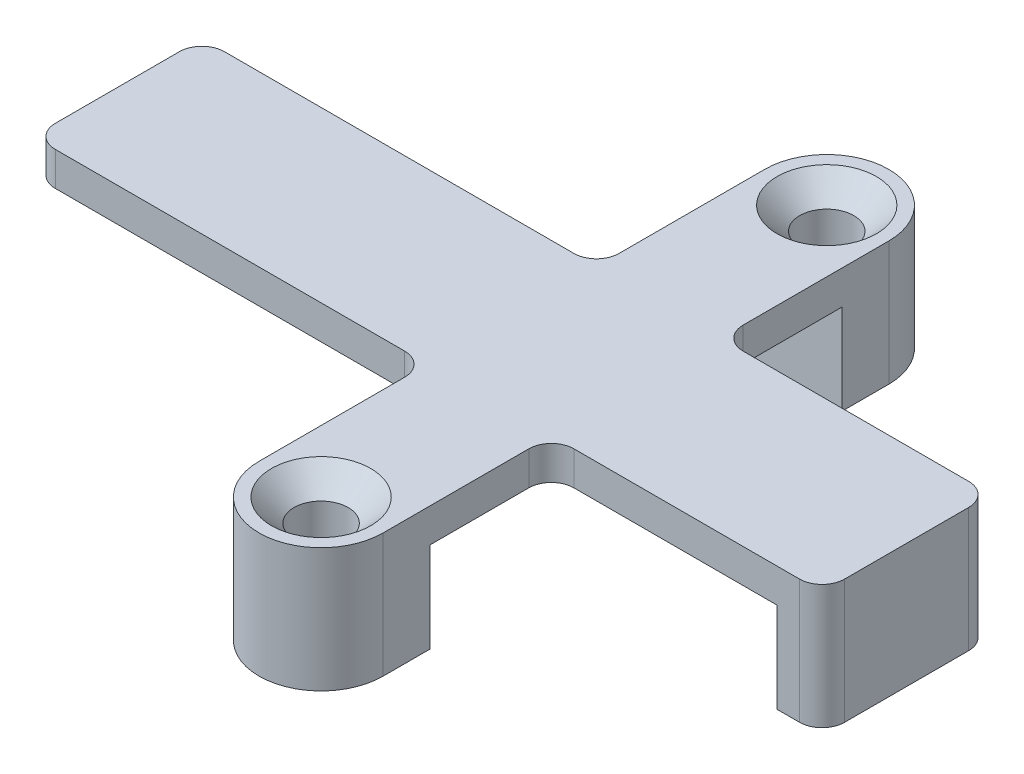
ISO-10303-21;
HEADER;
FILE_DESCRIPTION(('STEP AP214'),'2;1');
FILE_NAME('part.step','',(''),(''),'','','');
FILE_SCHEMA(('AUTOMOTIVE_DESIGN { 1 0 10303 214 1 1 1 1 }'));
ENDSEC;
DATA;
#1=APPLICATION_CONTEXT('core data for automotive mechanical design processes');
#2=APPLICATION_PROTOCOL_DEFINITION('international standard','automotive_design',2000,#1);
#3=PRODUCT_CONTEXT('',#1,'mechanical');
#4=PRODUCT('Part','Part','',(#3));
#5=PRODUCT_RELATED_PRODUCT_CATEGORY('part','',(#4));
#6=PRODUCT_DEFINITION_FORMATION('','',#4);
#7=PRODUCT_DEFINITION_CONTEXT('part definition',#1,'design');
#8=PRODUCT_DEFINITION('design','',#6,#7);
#9=PRODUCT_DEFINITION_SHAPE('','',#8);
#10=(LENGTH_UNIT() NAMED_UNIT(*) SI_UNIT(.MILLI.,.METRE.));
#11=(NAMED_UNIT(*) PLANE_ANGLE_UNIT() SI_UNIT($,.RADIAN.));
#12=(NAMED_UNIT(*) SI_UNIT($,.STERADIAN.) SOLID_ANGLE_UNIT());
#13=UNCERTAINTY_MEASURE_WITH_UNIT(LENGTH_MEASURE(1.E-05),#10,'distance_accuracy_value','');
#14=(GEOMETRIC_REPRESENTATION_CONTEXT(3) GLOBAL_UNCERTAINTY_ASSIGNED_CONTEXT((#13)) GLOBAL_UNIT_ASSIGNED_CONTEXT((#10,
#11,#12)) REPRESENTATION_CONTEXT('',''));
#15=CARTESIAN_POINT('',(0.,0.,0.));
#16=DIRECTION('',(0.,0.,1.));
#17=DIRECTION('',(1.,0.,0.));
#18=AXIS2_PLACEMENT_3D('',#15,#16,#17);
#19=CARTESIAN_POINT('',(0.,0.,0.));
#20=DIRECTION('',(0.,1.,0.));
#21=DIRECTION('',(0.,0.,1.));
#22=AXIS2_PLACEMENT_3D('',#19,#20,#21);
#23=PLANE('',#22);
#24=DIRECTION('',(-1.,0.,0.));
#25=VECTOR('',#24,1.);
#26=CARTESIAN_POINT('',(0.,0.,3.75));
#27=LINE('',#26,#25);
#28=CARTESIAN_POINT('',(-3.75,0.,3.75));
#29=VERTEX_POINT('',#28);
#30=CARTESIAN_POINT('',(-19.24,0.,3.75));
#31=VERTEX_POINT('',#30);
#32=EDGE_CURVE('E345',#29,#31,#27,.T.);
#33=ORIENTED_EDGE('',*,*,#32,.T.);
#34=CARTESIAN_POINT('',(-19.24,0.,2.75));
#35=DIRECTION('',(0.,1.,0.));
#36=DIRECTION('',(0.,0.,1.));
#37=AXIS2_PLACEMENT_3D('',#34,#35,#36);
#38=CIRCLE('',#37,1.);
#39=CARTESIAN_POINT('',(-20.24,0.,2.75));
#40=VERTEX_POINT('',#39);
#41=EDGE_CURVE('E391',#31,#40,#38,.F.);
#42=ORIENTED_EDGE('',*,*,#41,.T.);
#43=DIRECTION('',(0.,0.,1.));
#44=VECTOR('',#43,1.);
#45=CARTESIAN_POINT('',(-20.24,0.,0.));
#46=LINE('',#45,#44);
#47=CARTESIAN_POINT('',(-20.24,0.,-2.75));
#48=VERTEX_POINT('',#47);
#49=EDGE_CURVE('E342',#48,#40,#46,.T.);
#50=ORIENTED_EDGE('',*,*,#49,.F.);
#51=CARTESIAN_POINT('',(-19.24,0.,-2.75));
#52=DIRECTION('',(0.,1.,0.));
#53=DIRECTION('',(0.,0.,1.));
#54=AXIS2_PLACEMENT_3D('',#51,#52,#53);
#55=CIRCLE('',#54,1.);
#56=CARTESIAN_POINT('',(-19.24,0.,-3.75));
#57=VERTEX_POINT('',#56);
#58=EDGE_CURVE('E389',#48,#57,#55,.F.);
#59=ORIENTED_EDGE('',*,*,#58,.T.);
#60=DIRECTION('',(-1.,0.,0.));
#61=VECTOR('',#60,1.);
#62=CARTESIAN_POINT('',(0.,0.,-3.75));
#63=LINE('',#62,#61);
#64=CARTESIAN_POINT('',(-3.75,0.,-3.75));
#65=VERTEX_POINT('',#64);
#66=EDGE_CURVE('E339',#65,#57,#63,.T.);
#67=ORIENTED_EDGE('',*,*,#66,.F.);
#68=CARTESIAN_POINT('',(-3.75,0.,-4.75));
#69=DIRECTION('',(0.,1.,0.));
#70=DIRECTION('',(0.,0.,1.));
#71=AXIS2_PLACEMENT_3D('',#68,#69,#70);
#72=CIRCLE('',#71,1.);
#73=CARTESIAN_POINT('',(-2.75,0.,-4.75));
#74=VERTEX_POINT('',#73);
#75=EDGE_CURVE('E55',#65,#74,#72,.T.);
#76=ORIENTED_EDGE('',*,*,#75,.T.);
#77=DIRECTION('',(0.,0.,1.));
#78=VECTOR('',#77,1.);
#79=CARTESIAN_POINT('',(-2.75,0.,0.));
#80=LINE('',#79,#78);
#81=CARTESIAN_POINT('',(-2.75,0.,-9.125));
#82=VERTEX_POINT('',#81);
#83=EDGE_CURVE('E336',#82,#74,#80,.T.);
#84=ORIENTED_EDGE('',*,*,#83,.F.);
#85=DIRECTION('',(-1.,0.,0.));
#86=VECTOR('',#85,1.);
#87=CARTESIAN_POINT('',(0.,0.,-9.125));
#88=LINE('',#87,#86);
#89=CARTESIAN_POINT('',(2.74999999999999,0.,-9.125));
#90=VERTEX_POINT('',#89);
#91=EDGE_CURVE('E259',#90,#82,#88,.T.);
#92=ORIENTED_EDGE('',*,*,#91,.F.);
#93=DIRECTION('',(0.,0.,1.));
#94=VECTOR('',#93,1.);
#95=CARTESIAN_POINT('',(2.75,0.,0.));
#96=LINE('',#95,#94);
#97=CARTESIAN_POINT('',(2.74999999999999,0.,-4.75));
#98=VERTEX_POINT('',#97);
#99=EDGE_CURVE('E334',#90,#98,#96,.T.);
#100=ORIENTED_EDGE('',*,*,#99,.T.);
#101=CARTESIAN_POINT('',(3.74999999999999,0.,-4.75));
#102=DIRECTION('',(0.,1.,0.));
#103=DIRECTION('',(0.,0.,1.));
#104=AXIS2_PLACEMENT_3D('',#101,#102,#103);
#105=CIRCLE('',#104,1.);
#106=CARTESIAN_POINT('',(3.74999999999999,0.,-3.75));
#107=VERTEX_POINT('',#106);
#108=EDGE_CURVE('E62',#98,#107,#105,.T.);
#109=ORIENTED_EDGE('',*,*,#108,.T.);
#110=DIRECTION('',(1.,0.,0.));
#111=VECTOR('',#110,1.);
#112=CARTESIAN_POINT('',(0.,0.,-3.75));
#113=LINE('',#112,#111);
#114=CARTESIAN_POINT('',(12.75,0.,-3.75));
#115=VERTEX_POINT('',#114);
#116=EDGE_CURVE('E298',#107,#115,#113,.T.);
#117=ORIENTED_EDGE('',*,*,#116,.T.);
#118=DIRECTION('',(0.,0.,1.));
#119=VECTOR('',#118,1.);
#120=CARTESIAN_POINT('',(12.75,0.,0.));
#121=LINE('',#120,#119);
#122=CARTESIAN_POINT('',(12.75,0.,3.75));
#123=VERTEX_POINT('',#122);
#124=EDGE_CURVE('E278',#115,#123,#121,.T.);
#125=ORIENTED_EDGE('',*,*,#124,.T.);
#126=DIRECTION('',(1.,0.,0.));
#127=VECTOR('',#126,1.);
#128=CARTESIAN_POINT('',(0.,0.,3.75));
#129=LINE('',#128,#127);
#130=CARTESIAN_POINT('',(3.75,0.,3.75));
#131=VERTEX_POINT('',#130);
#132=EDGE_CURVE('E305',#131,#123,#129,.T.);
#133=ORIENTED_EDGE('',*,*,#132,.F.);
#134=CARTESIAN_POINT('',(3.75,0.,4.75));
#135=DIRECTION('',(0.,1.,0.));
#136=DIRECTION('',(0.,0.,1.));
#137=AXIS2_PLACEMENT_3D('',#134,#135,#136);
#138=CIRCLE('',#137,1.);
#139=CARTESIAN_POINT('',(2.75,0.,4.75));
#140=VERTEX_POINT('',#139);
#141=EDGE_CURVE('E412',#131,#140,#138,.T.);
#142=ORIENTED_EDGE('',*,*,#141,.T.);
#143=DIRECTION('',(0.,0.,1.));
#144=VECTOR('',#143,1.);
#145=CARTESIAN_POINT('',(2.75,0.,0.));
#146=LINE('',#145,#144);
#147=CARTESIAN_POINT('',(2.75,0.,9.125));
#148=VERTEX_POINT('',#147);
#149=EDGE_CURVE('E350',#140,#148,#146,.T.);
#150=ORIENTED_EDGE('',*,*,#149,.T.);
#151=DIRECTION('',(-1.,0.,0.));
#152=VECTOR('',#151,1.);
#153=CARTESIAN_POINT('',(0.,0.,9.125));
#154=LINE('',#153,#152);
#155=CARTESIAN_POINT('',(-2.74999999999999,0.,9.125));
#156=VERTEX_POINT('',#155);
#157=EDGE_CURVE('E246',#148,#156,#154,.T.);
#158=ORIENTED_EDGE('',*,*,#157,.T.);
#159=DIRECTION('',(0.,0.,1.));
#160=VECTOR('',#159,1.);
#161=CARTESIAN_POINT('',(-2.75,0.,0.));
#162=LINE('',#161,#160);
#163=CARTESIAN_POINT('',(-2.75,0.,4.75));
#164=VERTEX_POINT('',#163);
#165=EDGE_CURVE('E348',#164,#156,#162,.T.);
#166=ORIENTED_EDGE('',*,*,#165,.F.);
#167=CARTESIAN_POINT('',(-3.75,0.,4.75));
#168=DIRECTION('',(0.,1.,0.));
#169=DIRECTION('',(0.,0.,1.));
#170=AXIS2_PLACEMENT_3D('',#167,#168,#169);
#171=CIRCLE('',#170,1.);
#172=EDGE_CURVE('E416',#164,#29,#171,.T.);
#173=ORIENTED_EDGE('',*,*,#172,.T.);
#174=EDGE_LOOP('',(#33,#42,#50,#59,#67,#76,#84,#92,#100,#109,#117,#125,#133,#142,#150,#158,#166,#173));
#175=FACE_BOUND('',#174,.T.);
#176=ADVANCED_FACE('F47',(#175),#23,.F.);
#177=CARTESIAN_POINT('',(14.75,1.5,0.));
#178=DIRECTION('',(1.,0.,0.));
#179=DIRECTION('',(0.,0.,-1.));
#180=AXIS2_PLACEMENT_3D('',#177,#178,#179);
#181=PLANE('',#180);
#182=DIRECTION('',(0.,0.,1.));
#183=VECTOR('',#182,1.);
#184=CARTESIAN_POINT('',(14.75,1.5,0.));
#185=LINE('',#184,#183);
#186=CARTESIAN_POINT('',(14.75,1.5,-2.75));
#187=VERTEX_POINT('',#186);
#188=CARTESIAN_POINT('',(14.75,1.5,2.75));
#189=VERTEX_POINT('',#188);
#190=EDGE_CURVE('E301',#187,#189,#185,.T.);
#191=ORIENTED_EDGE('',*,*,#190,.T.);
#192=DIRECTION('',(0.,-1.,0.));
#193=VECTOR('',#192,1.);
#194=CARTESIAN_POINT('',(14.75,-4.,2.75));
#195=LINE('',#194,#193);
#196=CARTESIAN_POINT('',(14.75,-4.,2.75));
#197=VERTEX_POINT('',#196);
#198=EDGE_CURVE('E359',#189,#197,#195,.T.);
#199=ORIENTED_EDGE('',*,*,#198,.T.);
#200=DIRECTION('',(0.,0.,1.));
#201=VECTOR('',#200,1.);
#202=CARTESIAN_POINT('',(14.75,-4.,0.));
#203=LINE('',#202,#201);
#204=CARTESIAN_POINT('',(14.75,-4.,-2.75));
#205=VERTEX_POINT('',#204);
#206=EDGE_CURVE('E280',#205,#197,#203,.T.);
#207=ORIENTED_EDGE('',*,*,#206,.F.);
#208=DIRECTION('',(0.,-1.,0.));
#209=VECTOR('',#208,1.);
#210=CARTESIAN_POINT('',(14.75,1.5,-2.75));
#211=LINE('',#210,#209);
#212=EDGE_CURVE('E357',#205,#187,#211,.F.);
#213=ORIENTED_EDGE('',*,*,#212,.T.);
#214=EDGE_LOOP('',(#191,#199,#207,#213));
#215=FACE_BOUND('',#214,.T.);
#216=ADVANCED_FACE('F493',(#215),#181,.T.);
#217=CARTESIAN_POINT('',(0.,1.5,-3.75));
#218=DIRECTION('',(0.,0.,-1.));
#219=DIRECTION('',(-1.,0.,0.));
#220=AXIS2_PLACEMENT_3D('',#217,#218,#219);
#221=PLANE('',#220);
#222=ORIENTED_EDGE('',*,*,#116,.F.);
#223=DIRECTION('',(0.,-1.,0.));
#224=VECTOR('',#223,1.);
#225=CARTESIAN_POINT('',(3.74999999999999,1.5,-3.75));
#226=LINE('',#225,#224);
#227=CARTESIAN_POINT('',(3.74999999999999,1.5,-3.75));
#228=VERTEX_POINT('',#227);
#229=EDGE_CURVE('E408',#107,#228,#226,.F.);
#230=ORIENTED_EDGE('',*,*,#229,.T.);
#231=DIRECTION('',(1.,0.,0.));
#232=VECTOR('',#231,1.);
#233=CARTESIAN_POINT('',(0.,1.5,-3.75));
#234=LINE('',#233,#232);
#235=CARTESIAN_POINT('',(13.75,1.5,-3.75));
#236=VERTEX_POINT('',#235);
#237=EDGE_CURVE('E304',#228,#236,#234,.T.);
#238=ORIENTED_EDGE('',*,*,#237,.T.);
#239=DIRECTION('',(0.,-1.,0.));
#240=VECTOR('',#239,1.);
#241=CARTESIAN_POINT('',(13.75,1.5,-3.75));
#242=LINE('',#241,#240);
#243=CARTESIAN_POINT('',(13.75,-4.,-3.75));
#244=VERTEX_POINT('',#243);
#245=EDGE_CURVE('E405',#236,#244,#242,.T.);
#246=ORIENTED_EDGE('',*,*,#245,.T.);
#247=DIRECTION('',(1.,0.,0.));
#248=VECTOR('',#247,1.);
#249=CARTESIAN_POINT('',(0.,-4.,-3.75));
#250=LINE('',#249,#248);
#251=CARTESIAN_POINT('',(12.75,-4.,-3.75));
#252=VERTEX_POINT('',#251);
#253=EDGE_CURVE('E283',#252,#244,#250,.T.);
#254=ORIENTED_EDGE('',*,*,#253,.F.);
#255=DIRECTION('',(0.,1.,0.));
#256=VECTOR('',#255,1.);
#257=CARTESIAN_POINT('',(12.75,-4.,-3.75));
#258=LINE('',#257,#256);
#259=EDGE_CURVE('E292',#252,#115,#258,.T.);
#260=ORIENTED_EDGE('',*,*,#259,.T.);
#261=EDGE_LOOP('',(#222,#230,#238,#246,#254,#260));
#262=FACE_BOUND('',#261,.T.);
#263=ADVANCED_FACE('F502',(#262),#221,.T.);
#264=CARTESIAN_POINT('',(2.75,1.5,0.));
#265=DIRECTION('',(1.,0.,0.));
#266=DIRECTION('',(0.,0.,-1.));
#267=AXIS2_PLACEMENT_3D('',#264,#265,#266);
#268=PLANE('',#267);
#269=DIRECTION('',(0.,0.,1.));
#270=VECTOR('',#269,1.);
#271=CARTESIAN_POINT('',(2.75,1.5,0.));
#272=LINE('',#271,#270);
#273=CARTESIAN_POINT('',(2.74999999999999,1.5,-11.2072));
#274=VERTEX_POINT('',#273);
#275=CARTESIAN_POINT('',(2.74999999999999,1.5,-4.75));
#276=VERTEX_POINT('',#275);
#277=EDGE_CURVE('E308',#274,#276,#272,.T.);
#278=ORIENTED_EDGE('',*,*,#277,.T.);
#279=DIRECTION('',(0.,-1.,0.));
#280=VECTOR('',#279,1.);
#281=CARTESIAN_POINT('',(2.74999999999999,0.,-4.75));
#282=LINE('',#281,#280);
#283=EDGE_CURVE('E403',#276,#98,#282,.T.);
#284=ORIENTED_EDGE('',*,*,#283,.T.);
#285=ORIENTED_EDGE('',*,*,#99,.F.);
#286=DIRECTION('',(0.,1.,0.));
#287=VECTOR('',#286,1.);
#288=CARTESIAN_POINT('',(2.74999999999999,-4.,-9.125));
#289=LINE('',#288,#287);
#290=CARTESIAN_POINT('',(2.74999999999999,-4.,-9.125));
#291=VERTEX_POINT('',#290);
#292=EDGE_CURVE('E276',#291,#90,#289,.T.);
#293=ORIENTED_EDGE('',*,*,#292,.F.);
#294=DIRECTION('',(0.,0.,1.));
#295=VECTOR('',#294,1.);
#296=CARTESIAN_POINT('',(2.75,-4.,0.));
#297=LINE('',#296,#295);
#298=CARTESIAN_POINT('',(2.74999999999999,-4.,-11.2072));
#299=VERTEX_POINT('',#298);
#300=EDGE_CURVE('E262',#299,#291,#297,.T.);
#301=ORIENTED_EDGE('',*,*,#300,.F.);
#302=DIRECTION('',(0.,-1.,0.));
#303=VECTOR('',#302,1.);
#304=CARTESIAN_POINT('',(2.74999999999999,1.5,-11.2072));
#305=LINE('',#304,#303);
#306=EDGE_CURVE('E355',#274,#299,#305,.T.);
#307=ORIENTED_EDGE('',*,*,#306,.F.);
#308=EDGE_LOOP('',(#278,#284,#285,#293,#301,#307));
#309=FACE_BOUND('',#308,.T.);
#310=ADVANCED_FACE('F506',(#309),#268,.T.);
#311=CARTESIAN_POINT('',(0.,1.5,-11.2072));
#312=DIRECTION('',(0.,-1.,0.));
#313=DIRECTION('',(0.,0.,-1.));
#314=AXIS2_PLACEMENT_3D('',#311,#312,#313);
#315=CYLINDRICAL_SURFACE('',#314,2.75);
#316=ORIENTED_EDGE('',*,*,#306,.T.);
#317=CARTESIAN_POINT('',(0.,-4.,-11.2072));
#318=DIRECTION('',(0.,1.,0.));
#319=DIRECTION('',(0.,0.,1.));
#320=AXIS2_PLACEMENT_3D('',#317,#318,#319);
#321=CIRCLE('',#320,2.75);
#322=CARTESIAN_POINT('',(-2.75,-4.,-11.2072));
#323=VERTEX_POINT('',#322);
#324=EDGE_CURVE('E265',#299,#323,#321,.T.);
#325=ORIENTED_EDGE('',*,*,#324,.T.);
#326=DIRECTION('',(0.,-1.,0.));
#327=VECTOR('',#326,1.);
#328=CARTESIAN_POINT('',(-2.75,1.5,-11.2072));
#329=LINE('',#328,#327);
#330=CARTESIAN_POINT('',(-2.75,1.5,-11.2072));
#331=VERTEX_POINT('',#330);
#332=EDGE_CURVE('E230',#331,#323,#329,.T.);
#333=ORIENTED_EDGE('',*,*,#332,.F.);
#334=CARTESIAN_POINT('',(0.,1.5,-11.2072));
#335=DIRECTION('',(0.,1.,0.));
#336=DIRECTION('',(0.,0.,1.));
#337=AXIS2_PLACEMENT_3D('',#334,#335,#336);
#338=CIRCLE('',#337,2.75);
#339=EDGE_CURVE('E311',#274,#331,#338,.T.);
#340=ORIENTED_EDGE('',*,*,#339,.F.);
#341=EDGE_LOOP('',(#316,#325,#333,#340));
#342=FACE_BOUND('',#341,.T.);
#343=ADVANCED_FACE('F514',(#342),#315,.T.);
#344=CARTESIAN_POINT('',(-2.75,1.5,0.));
#345=DIRECTION('',(1.,0.,0.));
#346=DIRECTION('',(0.,0.,-1.));
#347=AXIS2_PLACEMENT_3D('',#344,#345,#346);
#348=PLANE('',#347);
#349=ORIENTED_EDGE('',*,*,#83,.T.);
#350=DIRECTION('',(0.,-1.,0.));
#351=VECTOR('',#350,1.);
#352=CARTESIAN_POINT('',(-2.75,1.5,-4.75));
#353=LINE('',#352,#351);
#354=CARTESIAN_POINT('',(-2.75,1.5,-4.75));
#355=VERTEX_POINT('',#354);
#356=EDGE_CURVE('E410',#74,#355,#353,.F.);
#357=ORIENTED_EDGE('',*,*,#356,.T.);
#358=DIRECTION('',(0.,0.,1.));
#359=VECTOR('',#358,1.);
#360=CARTESIAN_POINT('',(-2.75,1.5,0.));
#361=LINE('',#360,#359);
#362=EDGE_CURVE('E313',#331,#355,#361,.T.);
#363=ORIENTED_EDGE('',*,*,#362,.F.);
#364=ORIENTED_EDGE('',*,*,#332,.T.);
#365=DIRECTION('',(0.,0.,1.));
#366=VECTOR('',#365,1.);
#367=CARTESIAN_POINT('',(-2.75,-4.,0.));
#368=LINE('',#367,#366);
#369=CARTESIAN_POINT('',(-2.75,-4.,-9.125));
#370=VERTEX_POINT('',#369);
#371=EDGE_CURVE('E268',#323,#370,#368,.T.);
#372=ORIENTED_EDGE('',*,*,#371,.T.);
#373=DIRECTION('',(0.,1.,0.));
#374=VECTOR('',#373,1.);
#375=CARTESIAN_POINT('',(-2.75,-4.,-9.125));
#376=LINE('',#375,#374);
#377=EDGE_CURVE('E273',#370,#82,#376,.T.);
#378=ORIENTED_EDGE('',*,*,#377,.T.);
#379=EDGE_LOOP('',(#349,#357,#363,#364,#372,#378));
#380=FACE_BOUND('',#379,.T.);
#381=ADVANCED_FACE('F429',(#380),#348,.F.);
#382=CARTESIAN_POINT('',(0.,1.5,-3.75));
#383=DIRECTION('',(0.,0.,1.));
#384=DIRECTION('',(1.,0.,0.));
#385=AXIS2_PLACEMENT_3D('',#382,#383,#384);
#386=PLANE('',#385);
#387=ORIENTED_EDGE('',*,*,#66,.T.);
#388=DIRECTION('',(0.,-1.,0.));
#389=VECTOR('',#388,1.);
#390=CARTESIAN_POINT('',(-19.24,1.5,-3.75));
#391=LINE('',#390,#389);
#392=CARTESIAN_POINT('',(-19.24,1.5,-3.75));
#393=VERTEX_POINT('',#392);
#394=EDGE_CURVE('E401',#57,#393,#391,.F.);
#395=ORIENTED_EDGE('',*,*,#394,.T.);
#396=DIRECTION('',(-1.,0.,0.));
#397=VECTOR('',#396,1.);
#398=CARTESIAN_POINT('',(0.,1.5,-3.75));
#399=LINE('',#398,#397);
#400=CARTESIAN_POINT('',(-3.75,1.5,-3.75));
#401=VERTEX_POINT('',#400);
#402=EDGE_CURVE('E316',#401,#393,#399,.T.);
#403=ORIENTED_EDGE('',*,*,#402,.F.);
#404=DIRECTION('',(0.,-1.,0.));
#405=VECTOR('',#404,1.);
#406=CARTESIAN_POINT('',(-3.75,0.,-3.75));
#407=LINE('',#406,#405);
#408=EDGE_CURVE('E398',#401,#65,#407,.T.);
#409=ORIENTED_EDGE('',*,*,#408,.T.);
#410=EDGE_LOOP('',(#387,#395,#403,#409));
#411=FACE_BOUND('',#410,.T.);
#412=ADVANCED_FACE('F438',(#411),#386,.F.);
#413=CARTESIAN_POINT('',(-20.24,1.5,0.));
#414=DIRECTION('',(1.,0.,0.));
#415=DIRECTION('',(0.,0.,-1.));
#416=AXIS2_PLACEMENT_3D('',#413,#414,#415);
#417=PLANE('',#416);
#418=ORIENTED_EDGE('',*,*,#49,.T.);
#419=DIRECTION('',(0.,-1.,0.));
#420=VECTOR('',#419,1.);
#421=CARTESIAN_POINT('',(-20.24,1.5,2.75));
#422=LINE('',#421,#420);
#423=CARTESIAN_POINT('',(-20.24,1.5,2.75));
#424=VERTEX_POINT('',#423);
#425=EDGE_CURVE('E396',#40,#424,#422,.F.);
#426=ORIENTED_EDGE('',*,*,#425,.T.);
#427=DIRECTION('',(0.,0.,1.));
#428=VECTOR('',#427,1.);
#429=CARTESIAN_POINT('',(-20.24,1.5,0.));
#430=LINE('',#429,#428);
#431=CARTESIAN_POINT('',(-20.24,1.5,-2.75));
#432=VERTEX_POINT('',#431);
#433=EDGE_CURVE('E319',#432,#424,#430,.T.);
#434=ORIENTED_EDGE('',*,*,#433,.F.);
#435=DIRECTION('',(0.,-1.,0.));
#436=VECTOR('',#435,1.);
#437=CARTESIAN_POINT('',(-20.24,1.5,-2.75));
#438=LINE('',#437,#436);
#439=EDGE_CURVE('E393',#432,#48,#438,.T.);
#440=ORIENTED_EDGE('',*,*,#439,.T.);
#441=EDGE_LOOP('',(#418,#426,#434,#440));
#442=FACE_BOUND('',#441,.T.);
#443=ADVANCED_FACE('F446',(#442),#417,.F.);
#444=CARTESIAN_POINT('',(0.,1.5,3.75));
#445=DIRECTION('',(0.,0.,1.));
#446=DIRECTION('',(1.,0.,0.));
#447=AXIS2_PLACEMENT_3D('',#444,#445,#446);
#448=PLANE('',#447);
#449=ORIENTED_EDGE('',*,*,#32,.F.);
#450=DIRECTION('',(0.,-1.,0.));
#451=VECTOR('',#450,1.);
#452=CARTESIAN_POINT('',(-3.75,1.5,3.75));
#453=LINE('',#452,#451);
#454=CARTESIAN_POINT('',(-3.75,1.5,3.75));
#455=VERTEX_POINT('',#454);
#456=EDGE_CURVE('E387',#29,#455,#453,.F.);
#457=ORIENTED_EDGE('',*,*,#456,.T.);
#458=DIRECTION('',(-1.,0.,0.));
#459=VECTOR('',#458,1.);
#460=CARTESIAN_POINT('',(0.,1.5,3.75));
#461=LINE('',#460,#459);
#462=CARTESIAN_POINT('',(-19.24,1.5,3.75));
#463=VERTEX_POINT('',#462);
#464=EDGE_CURVE('E322',#455,#463,#461,.T.);
#465=ORIENTED_EDGE('',*,*,#464,.T.);
#466=DIRECTION('',(0.,-1.,0.));
#467=VECTOR('',#466,1.);
#468=CARTESIAN_POINT('',(-19.24,0.,3.75));
#469=LINE('',#468,#467);
#470=EDGE_CURVE('E384',#463,#31,#469,.T.);
#471=ORIENTED_EDGE('',*,*,#470,.T.);
#472=EDGE_LOOP('',(#449,#457,#465,#471));
#473=FACE_BOUND('',#472,.T.);
#474=ADVANCED_FACE('F456',(#473),#448,.T.);
#475=CARTESIAN_POINT('',(-2.75,1.5,0.));
#476=DIRECTION('',(1.,0.,0.));
#477=DIRECTION('',(0.,0.,-1.));
#478=AXIS2_PLACEMENT_3D('',#475,#476,#477);
#479=PLANE('',#478);
#480=DIRECTION('',(0.,0.,1.));
#481=VECTOR('',#480,1.);
#482=CARTESIAN_POINT('',(-2.75,1.5,0.));
#483=LINE('',#482,#481);
#484=CARTESIAN_POINT('',(-2.75,1.5,4.75));
#485=VERTEX_POINT('',#484);
#486=CARTESIAN_POINT('',(-2.74999999999999,1.5,11.2072));
#487=VERTEX_POINT('',#486);
#488=EDGE_CURVE('E325',#485,#487,#483,.T.);
#489=ORIENTED_EDGE('',*,*,#488,.F.);
#490=DIRECTION('',(0.,-1.,0.));
#491=VECTOR('',#490,1.);
#492=CARTESIAN_POINT('',(-2.75,1.5,4.75));
#493=LINE('',#492,#491);
#494=EDGE_CURVE('E381',#485,#164,#493,.T.);
#495=ORIENTED_EDGE('',*,*,#494,.T.);
#496=ORIENTED_EDGE('',*,*,#165,.T.);
#497=DIRECTION('',(0.,1.,0.));
#498=VECTOR('',#497,1.);
#499=CARTESIAN_POINT('',(-2.74999999999999,-4.,9.125));
#500=LINE('',#499,#498);
#501=CARTESIAN_POINT('',(-2.74999999999999,-4.,9.125));
#502=VERTEX_POINT('',#501);
#503=EDGE_CURVE('E245',#502,#156,#500,.T.);
#504=ORIENTED_EDGE('',*,*,#503,.F.);
#505=DIRECTION('',(0.,0.,1.));
#506=VECTOR('',#505,1.);
#507=CARTESIAN_POINT('',(-2.75,-4.,0.));
#508=LINE('',#507,#506);
#509=CARTESIAN_POINT('',(-2.74999999999999,-4.,11.2072));
#510=VERTEX_POINT('',#509);
#511=EDGE_CURVE('E238',#502,#510,#508,.T.);
#512=ORIENTED_EDGE('',*,*,#511,.T.);
#513=DIRECTION('',(0.,-1.,0.));
#514=VECTOR('',#513,1.);
#515=CARTESIAN_POINT('',(-2.74999999999999,1.5,11.2072));
#516=LINE('',#515,#514);
#517=EDGE_CURVE('E220',#487,#510,#516,.T.);
#518=ORIENTED_EDGE('',*,*,#517,.F.);
#519=EDGE_LOOP('',(#489,#495,#496,#504,#512,#518));
#520=FACE_BOUND('',#519,.T.);
#521=ADVANCED_FACE('F243',(#520),#479,.F.);
#522=CARTESIAN_POINT('',(0.,1.5,11.2072));
#523=DIRECTION('',(0.,-1.,0.));
#524=DIRECTION('',(0.,0.,-1.));
#525=AXIS2_PLACEMENT_3D('',#522,#523,#524);
#526=CYLINDRICAL_SURFACE('',#525,2.75);
#527=ORIENTED_EDGE('',*,*,#517,.T.);
#528=CARTESIAN_POINT('',(0.,-4.,11.2072));
#529=DIRECTION('',(0.,1.,0.));
#530=DIRECTION('',(0.,0.,1.));
#531=AXIS2_PLACEMENT_3D('',#528,#529,#530);
#532=CIRCLE('',#531,2.75);
#533=CARTESIAN_POINT('',(2.75,-4.,11.2072));
#534=VERTEX_POINT('',#533);
#535=EDGE_CURVE('E224',#510,#534,#532,.T.);
#536=ORIENTED_EDGE('',*,*,#535,.T.);
#537=DIRECTION('',(0.,-1.,0.));
#538=VECTOR('',#537,1.);
#539=CARTESIAN_POINT('',(2.75,1.5,11.2072));
#540=LINE('',#539,#538);
#541=CARTESIAN_POINT('',(2.75,1.5,11.2072));
#542=VERTEX_POINT('',#541);
#543=EDGE_CURVE('E231',#542,#534,#540,.T.);
#544=ORIENTED_EDGE('',*,*,#543,.F.);
#545=CARTESIAN_POINT('',(0.,1.5,11.2072));
#546=DIRECTION('',(0.,1.,0.));
#547=DIRECTION('',(0.,0.,1.));
#548=AXIS2_PLACEMENT_3D('',#545,#546,#547);
#549=CIRCLE('',#548,2.75);
#550=EDGE_CURVE('E226',#487,#542,#549,.T.);
#551=ORIENTED_EDGE('',*,*,#550,.F.);
#552=EDGE_LOOP('',(#527,#536,#544,#551));
#553=FACE_BOUND('',#552,.T.);
#554=ADVANCED_FACE('F222',(#553),#526,.T.);
#555=CARTESIAN_POINT('',(2.75,1.5,0.));
#556=DIRECTION('',(1.,0.,0.));
#557=DIRECTION('',(0.,0.,-1.));
#558=AXIS2_PLACEMENT_3D('',#555,#556,#557);
#559=PLANE('',#558);
#560=ORIENTED_EDGE('',*,*,#149,.F.);
#561=DIRECTION('',(0.,-1.,0.));
#562=VECTOR('',#561,1.);
#563=CARTESIAN_POINT('',(2.75,1.5,4.75));
#564=LINE('',#563,#562);
#565=CARTESIAN_POINT('',(2.75,1.5,4.75));
#566=VERTEX_POINT('',#565);
#567=EDGE_CURVE('E379',#140,#566,#564,.F.);
#568=ORIENTED_EDGE('',*,*,#567,.T.);
#569=DIRECTION('',(0.,0.,1.));
#570=VECTOR('',#569,1.);
#571=CARTESIAN_POINT('',(2.75,1.5,0.));
#572=LINE('',#571,#570);
#573=EDGE_CURVE('E328',#566,#542,#572,.T.);
#574=ORIENTED_EDGE('',*,*,#573,.T.);
#575=ORIENTED_EDGE('',*,*,#543,.T.);
#576=DIRECTION('',(0.,0.,1.));
#577=VECTOR('',#576,1.);
#578=CARTESIAN_POINT('',(2.75,-4.,0.));
#579=LINE('',#578,#577);
#580=CARTESIAN_POINT('',(2.75,-4.,9.125));
#581=VERTEX_POINT('',#580);
#582=EDGE_CURVE('E241',#581,#534,#579,.T.);
#583=ORIENTED_EDGE('',*,*,#582,.F.);
#584=DIRECTION('',(0.,1.,0.));
#585=VECTOR('',#584,1.);
#586=CARTESIAN_POINT('',(2.75,-4.,9.125));
#587=LINE('',#586,#585);
#588=EDGE_CURVE('E256',#581,#148,#587,.T.);
#589=ORIENTED_EDGE('',*,*,#588,.T.);
#590=EDGE_LOOP('',(#560,#568,#574,#575,#583,#589));
#591=FACE_BOUND('',#590,.T.);
#592=ADVANCED_FACE('F467',(#591),#559,.T.);
#593=CARTESIAN_POINT('',(0.,1.5,3.75));
#594=DIRECTION('',(0.,0.,-1.));
#595=DIRECTION('',(-1.,0.,0.));
#596=AXIS2_PLACEMENT_3D('',#593,#594,#595);
#597=PLANE('',#596);
#598=DIRECTION('',(1.,0.,0.));
#599=VECTOR('',#598,1.);
#600=CARTESIAN_POINT('',(0.,-4.,3.75));
#601=LINE('',#600,#599);
#602=CARTESIAN_POINT('',(12.75,-4.,3.75));
#603=VERTEX_POINT('',#602);
#604=CARTESIAN_POINT('',(13.75,-4.,3.75));
#605=VERTEX_POINT('',#604);
#606=EDGE_CURVE('E289',#603,#605,#601,.T.);
#607=ORIENTED_EDGE('',*,*,#606,.T.);
#608=DIRECTION('',(0.,-1.,0.));
#609=VECTOR('',#608,1.);
#610=CARTESIAN_POINT('',(13.75,1.5,3.75));
#611=LINE('',#610,#609);
#612=CARTESIAN_POINT('',(13.75,1.5,3.75));
#613=VERTEX_POINT('',#612);
#614=EDGE_CURVE('E369',#605,#613,#611,.F.);
#615=ORIENTED_EDGE('',*,*,#614,.T.);
#616=DIRECTION('',(1.,0.,0.));
#617=VECTOR('',#616,1.);
#618=CARTESIAN_POINT('',(0.,1.5,3.75));
#619=LINE('',#618,#617);
#620=CARTESIAN_POINT('',(3.75,1.5,3.75));
#621=VERTEX_POINT('',#620);
#622=EDGE_CURVE('E330',#621,#613,#619,.T.);
#623=ORIENTED_EDGE('',*,*,#622,.F.);
#624=DIRECTION('',(0.,-1.,0.));
#625=VECTOR('',#624,1.);
#626=CARTESIAN_POINT('',(3.75,1.5,3.75));
#627=LINE('',#626,#625);
#628=EDGE_CURVE('E366',#621,#131,#627,.T.);
#629=ORIENTED_EDGE('',*,*,#628,.T.);
#630=ORIENTED_EDGE('',*,*,#132,.T.);
#631=DIRECTION('',(0.,1.,0.));
#632=VECTOR('',#631,1.);
#633=CARTESIAN_POINT('',(12.75,-4.,3.75));
#634=LINE('',#633,#632);
#635=EDGE_CURVE('E295',#603,#123,#634,.T.);
#636=ORIENTED_EDGE('',*,*,#635,.F.);
#637=EDGE_LOOP('',(#607,#615,#623,#629,#630,#636));
#638=FACE_BOUND('',#637,.T.);
#639=ADVANCED_FACE('F477',(#638),#597,.F.);
#640=CARTESIAN_POINT('',(0.,1.5,0.));
#641=DIRECTION('',(0.,1.,0.));
#642=DIRECTION('',(0.,0.,1.));
#643=AXIS2_PLACEMENT_3D('',#640,#641,#642);
#644=PLANE('',#643);
#645=CARTESIAN_POINT('',(0.,1.5,-11.2072));
#646=DIRECTION('',(0.,1.,0.));
#647=DIRECTION('',(0.,0.,1.));
#648=AXIS2_PLACEMENT_3D('',#645,#646,#647);
#649=CIRCLE('',#648,2.2);
#650=CARTESIAN_POINT('',(0.,1.5,-9.0072));
#651=VERTEX_POINT('',#650);
#652=EDGE_CURVE('E858',#651,#651,#649,.T.);
#653=ORIENTED_EDGE('',*,*,#652,.F.);
#654=EDGE_LOOP('',(#653));
#655=FACE_BOUND('',#654,.T.);
#656=CARTESIAN_POINT('',(0.,1.5,11.2072));
#657=DIRECTION('',(0.,1.,0.));
#658=DIRECTION('',(0.,0.,1.));
#659=AXIS2_PLACEMENT_3D('',#656,#657,#658);
#660=CIRCLE('',#659,2.2);
#661=CARTESIAN_POINT('',(0.,1.5,13.4072));
#662=VERTEX_POINT('',#661);
#663=EDGE_CURVE('E846',#662,#662,#660,.T.);
#664=ORIENTED_EDGE('',*,*,#663,.F.);
#665=EDGE_LOOP('',(#664));
#666=FACE_BOUND('',#665,.T.);
#667=ORIENTED_EDGE('',*,*,#622,.T.);
#668=CARTESIAN_POINT('',(13.75,1.5,2.75));
#669=DIRECTION('',(0.,1.,0.));
#670=DIRECTION('',(0.,0.,1.));
#671=AXIS2_PLACEMENT_3D('',#668,#669,#670);
#672=CIRCLE('',#671,1.);
#673=EDGE_CURVE('E377',#613,#189,#672,.T.);
#674=ORIENTED_EDGE('',*,*,#673,.T.);
#675=ORIENTED_EDGE('',*,*,#190,.F.);
#676=CARTESIAN_POINT('',(13.75,1.5,-2.75));
#677=DIRECTION('',(0.,1.,0.));
#678=DIRECTION('',(0.,0.,1.));
#679=AXIS2_PLACEMENT_3D('',#676,#677,#678);
#680=CIRCLE('',#679,1.);
#681=EDGE_CURVE('E371',#187,#236,#680,.T.);
#682=ORIENTED_EDGE('',*,*,#681,.T.);
#683=ORIENTED_EDGE('',*,*,#237,.F.);
#684=CARTESIAN_POINT('',(3.74999999999999,1.5,-4.75));
#685=DIRECTION('',(0.,1.,0.));
#686=DIRECTION('',(0.,0.,1.));
#687=AXIS2_PLACEMENT_3D('',#684,#685,#686);
#688=CIRCLE('',#687,1.);
#689=EDGE_CURVE('E421',#228,#276,#688,.F.);
#690=ORIENTED_EDGE('',*,*,#689,.T.);
#691=ORIENTED_EDGE('',*,*,#277,.F.);
#692=ORIENTED_EDGE('',*,*,#339,.T.);
#693=ORIENTED_EDGE('',*,*,#362,.T.);
#694=CARTESIAN_POINT('',(-3.75,1.5,-4.75));
#695=DIRECTION('',(0.,1.,0.));
#696=DIRECTION('',(0.,0.,1.));
#697=AXIS2_PLACEMENT_3D('',#694,#695,#696);
#698=CIRCLE('',#697,1.);
#699=EDGE_CURVE('E13',#355,#401,#698,.F.);
#700=ORIENTED_EDGE('',*,*,#699,.T.);
#701=ORIENTED_EDGE('',*,*,#402,.T.);
#702=CARTESIAN_POINT('',(-19.24,1.5,-2.75));
#703=DIRECTION('',(0.,1.,0.));
#704=DIRECTION('',(0.,0.,1.));
#705=AXIS2_PLACEMENT_3D('',#702,#703,#704);
#706=CIRCLE('',#705,1.);
#707=EDGE_CURVE('E373',#393,#432,#706,.T.);
#708=ORIENTED_EDGE('',*,*,#707,.T.);
#709=ORIENTED_EDGE('',*,*,#433,.T.);
#710=CARTESIAN_POINT('',(-19.24,1.5,2.75));
#711=DIRECTION('',(0.,1.,0.));
#712=DIRECTION('',(0.,0.,1.));
#713=AXIS2_PLACEMENT_3D('',#710,#711,#712);
#714=CIRCLE('',#713,1.);
#715=EDGE_CURVE('E375',#424,#463,#714,.T.);
#716=ORIENTED_EDGE('',*,*,#715,.T.);
#717=ORIENTED_EDGE('',*,*,#464,.F.);
#718=CARTESIAN_POINT('',(-3.75,1.5,4.75));
#719=DIRECTION('',(0.,1.,0.));
#720=DIRECTION('',(0.,0.,1.));
#721=AXIS2_PLACEMENT_3D('',#718,#719,#720);
#722=CIRCLE('',#721,1.);
#723=EDGE_CURVE('E418',#455,#485,#722,.F.);
#724=ORIENTED_EDGE('',*,*,#723,.T.);
#725=ORIENTED_EDGE('',*,*,#488,.T.);
#726=ORIENTED_EDGE('',*,*,#550,.T.);
#727=ORIENTED_EDGE('',*,*,#573,.F.);
#728=CARTESIAN_POINT('',(3.75,1.5,4.75));
#729=DIRECTION('',(0.,1.,0.));
#730=DIRECTION('',(0.,0.,1.));
#731=AXIS2_PLACEMENT_3D('',#728,#729,#730);
#732=CIRCLE('',#731,1.);
#733=EDGE_CURVE('E414',#566,#621,#732,.F.);
#734=ORIENTED_EDGE('',*,*,#733,.T.);
#735=EDGE_LOOP('',(#667,#674,#675,#682,#683,#690,#691,#692,#693,#700,#701,#708,#709,#716,#717,
#724,#725,#726,#727,#734));
#736=FACE_BOUND('',#735,.T.);
#737=ADVANCED_FACE('F435',(#655,#666,#736),#644,.T.);
#738=CARTESIAN_POINT('',(12.75,-4.,0.));
#739=DIRECTION('',(-1.,0.,0.));
#740=DIRECTION('',(0.,0.,1.));
#741=AXIS2_PLACEMENT_3D('',#738,#739,#740);
#742=PLANE('',#741);
#743=ORIENTED_EDGE('',*,*,#124,.F.);
#744=ORIENTED_EDGE('',*,*,#259,.F.);
#745=DIRECTION('',(0.,0.,1.));
#746=VECTOR('',#745,1.);
#747=CARTESIAN_POINT('',(12.75,-4.,0.));
#748=LINE('',#747,#746);
#749=EDGE_CURVE('E286',#252,#603,#748,.T.);
#750=ORIENTED_EDGE('',*,*,#749,.T.);
#751=ORIENTED_EDGE('',*,*,#635,.T.);
#752=EDGE_LOOP('',(#743,#744,#750,#751));
#753=FACE_BOUND('',#752,.T.);
#754=ADVANCED_FACE('F480',(#753),#742,.T.);
#755=CARTESIAN_POINT('',(0.,-4.,0.));
#756=DIRECTION('',(0.,1.,0.));
#757=DIRECTION('',(0.,0.,1.));
#758=AXIS2_PLACEMENT_3D('',#755,#756,#757);
#759=PLANE('',#758);
#760=ORIENTED_EDGE('',*,*,#206,.T.);
#761=CARTESIAN_POINT('',(13.75,-4.,2.75));
#762=DIRECTION('',(0.,1.,0.));
#763=DIRECTION('',(0.,0.,1.));
#764=AXIS2_PLACEMENT_3D('',#761,#762,#763);
#765=CIRCLE('',#764,1.);
#766=EDGE_CURVE('E364',#197,#605,#765,.F.);
#767=ORIENTED_EDGE('',*,*,#766,.T.);
#768=ORIENTED_EDGE('',*,*,#606,.F.);
#769=ORIENTED_EDGE('',*,*,#749,.F.);
#770=ORIENTED_EDGE('',*,*,#253,.T.);
#771=CARTESIAN_POINT('',(13.75,-4.,-2.75));
#772=DIRECTION('',(0.,1.,0.));
#773=DIRECTION('',(0.,0.,1.));
#774=AXIS2_PLACEMENT_3D('',#771,#772,#773);
#775=CIRCLE('',#774,1.);
#776=EDGE_CURVE('E362',#244,#205,#775,.F.);
#777=ORIENTED_EDGE('',*,*,#776,.T.);
#778=EDGE_LOOP('',(#760,#767,#768,#769,#770,#777));
#779=FACE_BOUND('',#778,.T.);
#780=ADVANCED_FACE('F521',(#779),#759,.F.);
#781=CARTESIAN_POINT('',(0.,-4.,-9.125));
#782=DIRECTION('',(0.,0.,-1.));
#783=DIRECTION('',(-1.,0.,0.));
#784=AXIS2_PLACEMENT_3D('',#781,#782,#783);
#785=PLANE('',#784);
#786=ORIENTED_EDGE('',*,*,#91,.T.);
#787=ORIENTED_EDGE('',*,*,#377,.F.);
#788=DIRECTION('',(-1.,0.,0.));
#789=VECTOR('',#788,1.);
#790=CARTESIAN_POINT('',(0.,-4.,-9.125));
#791=LINE('',#790,#789);
#792=EDGE_CURVE('E271',#291,#370,#791,.T.);
#793=ORIENTED_EDGE('',*,*,#792,.F.);
#794=ORIENTED_EDGE('',*,*,#292,.T.);
#795=EDGE_LOOP('',(#786,#787,#793,#794));
#796=FACE_BOUND('',#795,.T.);
#797=ADVANCED_FACE('F519',(#796),#785,.F.);
#798=CARTESIAN_POINT('',(0.,-4.,0.));
#799=DIRECTION('',(0.,1.,0.));
#800=DIRECTION('',(0.,0.,1.));
#801=AXIS2_PLACEMENT_3D('',#798,#799,#800);
#802=PLANE('',#801);
#803=CARTESIAN_POINT('',(0.,-4.,-11.2072));
#804=DIRECTION('',(0.,1.,0.));
#805=DIRECTION('',(0.,0.,1.));
#806=AXIS2_PLACEMENT_3D('',#803,#804,#805);
#807=CIRCLE('',#806,1.2);
#808=CARTESIAN_POINT('',(0.,-4.,-10.0072));
#809=VERTEX_POINT('',#808);
#810=EDGE_CURVE('E850',#809,#809,#807,.T.);
#811=ORIENTED_EDGE('',*,*,#810,.T.);
#812=EDGE_LOOP('',(#811));
#813=FACE_BOUND('',#812,.T.);
#814=ORIENTED_EDGE('',*,*,#300,.T.);
#815=ORIENTED_EDGE('',*,*,#792,.T.);
#816=ORIENTED_EDGE('',*,*,#371,.F.);
#817=ORIENTED_EDGE('',*,*,#324,.F.);
#818=EDGE_LOOP('',(#814,#815,#816,#817));
#819=FACE_BOUND('',#818,.T.);
#820=ADVANCED_FACE('F517',(#813,#819),#802,.F.);
#821=CARTESIAN_POINT('',(0.,-4.,9.125));
#822=DIRECTION('',(0.,0.,-1.));
#823=DIRECTION('',(-1.,0.,0.));
#824=AXIS2_PLACEMENT_3D('',#821,#822,#823);
#825=PLANE('',#824);
#826=ORIENTED_EDGE('',*,*,#157,.F.);
#827=ORIENTED_EDGE('',*,*,#588,.F.);
#828=DIRECTION('',(-1.,0.,0.));
#829=VECTOR('',#828,1.);
#830=CARTESIAN_POINT('',(0.,-4.,9.125));
#831=LINE('',#830,#829);
#832=EDGE_CURVE('E255',#581,#502,#831,.T.);
#833=ORIENTED_EDGE('',*,*,#832,.T.);
#834=ORIENTED_EDGE('',*,*,#503,.T.);
#835=EDGE_LOOP('',(#826,#827,#833,#834));
#836=FACE_BOUND('',#835,.T.);
#837=ADVANCED_FACE('F465',(#836),#825,.T.);
#838=CARTESIAN_POINT('',(0.,-4.,0.));
#839=DIRECTION('',(0.,1.,0.));
#840=DIRECTION('',(0.,0.,1.));
#841=AXIS2_PLACEMENT_3D('',#838,#839,#840);
#842=PLANE('',#841);
#843=CARTESIAN_POINT('',(0.,-4.,11.2072));
#844=DIRECTION('',(0.,1.,0.));
#845=DIRECTION('',(0.,0.,1.));
#846=AXIS2_PLACEMENT_3D('',#843,#844,#845);
#847=CIRCLE('',#846,1.2);
#848=CARTESIAN_POINT('',(0.,-4.,12.4072));
#849=VERTEX_POINT('',#848);
#850=EDGE_CURVE('E249',#849,#849,#847,.T.);
#851=ORIENTED_EDGE('',*,*,#850,.T.);
#852=EDGE_LOOP('',(#851));
#853=FACE_BOUND('',#852,.T.);
#854=ORIENTED_EDGE('',*,*,#511,.F.);
#855=ORIENTED_EDGE('',*,*,#832,.F.);
#856=ORIENTED_EDGE('',*,*,#582,.T.);
#857=ORIENTED_EDGE('',*,*,#535,.F.);
#858=EDGE_LOOP('',(#854,#855,#856,#857));
#859=FACE_BOUND('',#858,.T.);
#860=ADVANCED_FACE('F236',(#853,#859),#842,.F.);
#861=CARTESIAN_POINT('',(0.,1.5,11.2072));
#862=DIRECTION('',(0.,1.,0.));
#863=DIRECTION('',(0.,0.,1.));
#864=AXIS2_PLACEMENT_3D('',#861,#862,#863);
#865=CYLINDRICAL_SURFACE('',#864,1.19999999999999);
#866=ORIENTED_EDGE('',*,*,#850,.F.);
#867=EDGE_LOOP('',(#866));
#868=FACE_BOUND('',#867,.T.);
#869=CARTESIAN_POINT('',(0.,0.499999999999999,11.2072));
#870=DIRECTION('',(0.,1.,0.));
#871=DIRECTION('',(0.,0.,1.));
#872=AXIS2_PLACEMENT_3D('',#869,#870,#871);
#873=CIRCLE('',#872,1.19999999999999);
#874=CARTESIAN_POINT('',(0.,0.499999999999999,12.4072));
#875=VERTEX_POINT('',#874);
#876=EDGE_CURVE('E844',#875,#875,#873,.T.);
#877=ORIENTED_EDGE('',*,*,#876,.T.);
#878=EDGE_LOOP('',(#877));
#879=FACE_BOUND('',#878,.T.);
#880=ADVANCED_FACE('F742',(#868,#879),#865,.F.);
#881=CARTESIAN_POINT('',(0.,1.5,11.2072));
#882=DIRECTION('',(0.,1.,0.));
#883=DIRECTION('',(0.,0.,1.));
#884=AXIS2_PLACEMENT_3D('',#881,#882,#883);
#885=CONICAL_SURFACE('',#884,2.2,0.785398163397453);
#886=ORIENTED_EDGE('',*,*,#876,.F.);
#887=EDGE_LOOP('',(#886));
#888=FACE_BOUND('',#887,.T.);
#889=ORIENTED_EDGE('',*,*,#663,.T.);
#890=EDGE_LOOP('',(#889));
#891=FACE_BOUND('',#890,.T.);
#892=ADVANCED_FACE('F732',(#888,#891),#885,.F.);
#893=CARTESIAN_POINT('',(0.,1.5,-11.2072));
#894=DIRECTION('',(0.,1.,0.));
#895=DIRECTION('',(0.,0.,1.));
#896=AXIS2_PLACEMENT_3D('',#893,#894,#895);
#897=CYLINDRICAL_SURFACE('',#896,1.19999999999999);
#898=ORIENTED_EDGE('',*,*,#810,.F.);
#899=EDGE_LOOP('',(#898));
#900=FACE_BOUND('',#899,.T.);
#901=CARTESIAN_POINT('',(0.,0.499999999999999,-11.2072));
#902=DIRECTION('',(0.,1.,0.));
#903=DIRECTION('',(0.,0.,1.));
#904=AXIS2_PLACEMENT_3D('',#901,#902,#903);
#905=CIRCLE('',#904,1.19999999999999);
#906=CARTESIAN_POINT('',(0.,0.499999999999999,-10.0072));
#907=VERTEX_POINT('',#906);
#908=EDGE_CURVE('E855',#907,#907,#905,.T.);
#909=ORIENTED_EDGE('',*,*,#908,.T.);
#910=EDGE_LOOP('',(#909));
#911=FACE_BOUND('',#910,.T.);
#912=ADVANCED_FACE('F722',(#900,#911),#897,.F.);
#913=CARTESIAN_POINT('',(0.,1.5,-11.2072));
#914=DIRECTION('',(0.,1.,0.));
#915=DIRECTION('',(0.,0.,1.));
#916=AXIS2_PLACEMENT_3D('',#913,#914,#915);
#917=CONICAL_SURFACE('',#916,2.2,0.785398163397453);
#918=ORIENTED_EDGE('',*,*,#908,.F.);
#919=EDGE_LOOP('',(#918));
#920=FACE_BOUND('',#919,.T.);
#921=ORIENTED_EDGE('',*,*,#652,.T.);
#922=EDGE_LOOP('',(#921));
#923=FACE_BOUND('',#922,.T.);
#924=ADVANCED_FACE('F563',(#920,#923),#917,.F.);
#925=CARTESIAN_POINT('',(13.75,1.5,2.75));
#926=DIRECTION('',(0.,1.,0.));
#927=DIRECTION('',(0.,0.,1.));
#928=AXIS2_PLACEMENT_3D('',#925,#926,#927);
#929=CYLINDRICAL_SURFACE('',#928,1.);
#930=ORIENTED_EDGE('',*,*,#673,.F.);
#931=ORIENTED_EDGE('',*,*,#614,.F.);
#932=ORIENTED_EDGE('',*,*,#766,.F.);
#933=ORIENTED_EDGE('',*,*,#198,.F.);
#934=EDGE_LOOP('',(#930,#931,#932,#933));
#935=FACE_BOUND('',#934,.T.);
#936=ADVANCED_FACE('F488',(#935),#929,.T.);
#937=CARTESIAN_POINT('',(3.75,1.5,4.75));
#938=DIRECTION('',(0.,-1.,0.));
#939=DIRECTION('',(0.,0.,-1.));
#940=AXIS2_PLACEMENT_3D('',#937,#938,#939);
#941=CYLINDRICAL_SURFACE('',#940,1.);
#942=ORIENTED_EDGE('',*,*,#733,.F.);
#943=ORIENTED_EDGE('',*,*,#567,.F.);
#944=ORIENTED_EDGE('',*,*,#141,.F.);
#945=ORIENTED_EDGE('',*,*,#628,.F.);
#946=EDGE_LOOP('',(#942,#943,#944,#945));
#947=FACE_BOUND('',#946,.T.);
#948=ADVANCED_FACE('F474',(#947),#941,.F.);
#949=CARTESIAN_POINT('',(-3.75,1.5,4.75));
#950=DIRECTION('',(0.,-1.,0.));
#951=DIRECTION('',(0.,0.,-1.));
#952=AXIS2_PLACEMENT_3D('',#949,#950,#951);
#953=CYLINDRICAL_SURFACE('',#952,1.);
#954=ORIENTED_EDGE('',*,*,#723,.F.);
#955=ORIENTED_EDGE('',*,*,#456,.F.);
#956=ORIENTED_EDGE('',*,*,#172,.F.);
#957=ORIENTED_EDGE('',*,*,#494,.F.);
#958=EDGE_LOOP('',(#954,#955,#956,#957));
#959=FACE_BOUND('',#958,.T.);
#960=ADVANCED_FACE('F459',(#959),#953,.F.);
#961=CARTESIAN_POINT('',(-19.24,1.5,2.75));
#962=DIRECTION('',(0.,1.,0.));
#963=DIRECTION('',(0.,0.,1.));
#964=AXIS2_PLACEMENT_3D('',#961,#962,#963);
#965=CYLINDRICAL_SURFACE('',#964,1.);
#966=ORIENTED_EDGE('',*,*,#715,.F.);
#967=ORIENTED_EDGE('',*,*,#425,.F.);
#968=ORIENTED_EDGE('',*,*,#41,.F.);
#969=ORIENTED_EDGE('',*,*,#470,.F.);
#970=EDGE_LOOP('',(#966,#967,#968,#969));
#971=FACE_BOUND('',#970,.T.);
#972=ADVANCED_FACE('F450',(#971),#965,.T.);
#973=CARTESIAN_POINT('',(-19.24,1.5,-2.75));
#974=DIRECTION('',(0.,-1.,0.));
#975=DIRECTION('',(0.,0.,-1.));
#976=AXIS2_PLACEMENT_3D('',#973,#974,#975);
#977=CYLINDRICAL_SURFACE('',#976,1.);
#978=ORIENTED_EDGE('',*,*,#707,.F.);
#979=ORIENTED_EDGE('',*,*,#394,.F.);
#980=ORIENTED_EDGE('',*,*,#58,.F.);
#981=ORIENTED_EDGE('',*,*,#439,.F.);
#982=EDGE_LOOP('',(#978,#979,#980,#981));
#983=FACE_BOUND('',#982,.T.);
#984=ADVANCED_FACE('F441',(#983),#977,.T.);
#985=CARTESIAN_POINT('',(3.74999999999999,1.5,-4.75));
#986=DIRECTION('',(0.,1.,0.));
#987=DIRECTION('',(0.,0.,1.));
#988=AXIS2_PLACEMENT_3D('',#985,#986,#987);
#989=CYLINDRICAL_SURFACE('',#988,1.);
#990=ORIENTED_EDGE('',*,*,#689,.F.);
#991=ORIENTED_EDGE('',*,*,#229,.F.);
#992=ORIENTED_EDGE('',*,*,#108,.F.);
#993=ORIENTED_EDGE('',*,*,#283,.F.);
#994=EDGE_LOOP('',(#990,#991,#992,#993));
#995=FACE_BOUND('',#994,.T.);
#996=ADVANCED_FACE('F503',(#995),#989,.F.);
#997=CARTESIAN_POINT('',(13.75,1.5,-2.75));
#998=DIRECTION('',(0.,-1.,0.));
#999=DIRECTION('',(0.,0.,-1.));
#1000=AXIS2_PLACEMENT_3D('',#997,#998,#999);
#1001=CYLINDRICAL_SURFACE('',#1000,1.);
#1002=ORIENTED_EDGE('',*,*,#681,.F.);
#1003=ORIENTED_EDGE('',*,*,#212,.F.);
#1004=ORIENTED_EDGE('',*,*,#776,.F.);
#1005=ORIENTED_EDGE('',*,*,#245,.F.);
#1006=EDGE_LOOP('',(#1002,#1003,#1004,#1005));
#1007=FACE_BOUND('',#1006,.T.);
#1008=ADVANCED_FACE('F497',(#1007),#1001,.T.);
#1009=CARTESIAN_POINT('',(-3.75,1.5,-4.75));
#1010=DIRECTION('',(0.,1.,0.));
#1011=DIRECTION('',(0.,0.,1.));
#1012=AXIS2_PLACEMENT_3D('',#1009,#1010,#1011);
#1013=CYLINDRICAL_SURFACE('',#1012,1.);
#1014=ORIENTED_EDGE('',*,*,#699,.F.);
#1015=ORIENTED_EDGE('',*,*,#356,.F.);
#1016=ORIENTED_EDGE('',*,*,#75,.F.);
#1017=ORIENTED_EDGE('',*,*,#408,.F.);
#1018=EDGE_LOOP('',(#1014,#1015,#1016,#1017));
#1019=FACE_BOUND('',#1018,.T.);
#1020=ADVANCED_FACE('F49',(#1019),#1013,.F.);
#1021=CLOSED_SHELL('',(#176,#216,#263,#310,#343,#381,#412,#443,#474,#521,#554,#592,#639,#737,
#754,#780,#797,#820,#837,#860,#880,#892,#912,#924,#936,#948,#960,#972,#984,#996,#1008,#1020));
#1022=MANIFOLD_SOLID_BREP('B2',#1021);
#1023=ADVANCED_BREP_SHAPE_REPRESENTATION('',(#18,#1022),#14);
#1024=SHAPE_DEFINITION_REPRESENTATION(#9,#1023);
ENDSEC;
END-ISO-10303-21;
